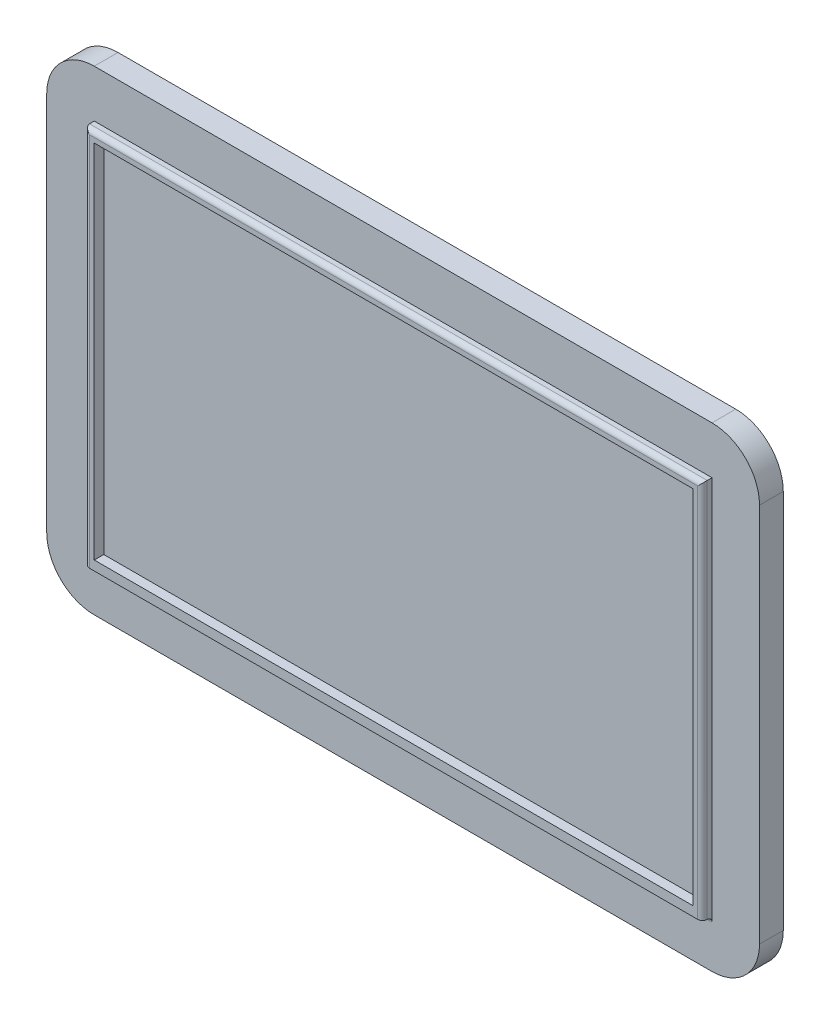
ISO-10303-21;
HEADER;
FILE_DESCRIPTION(('STEP AP214'),'2;1');
FILE_NAME('part.step','',(''),(''),'','','');
FILE_SCHEMA(('AUTOMOTIVE_DESIGN { 1 0 10303 214 1 1 1 1 }'));
ENDSEC;
DATA;
#1=APPLICATION_CONTEXT('core data for automotive mechanical design processes');
#2=APPLICATION_PROTOCOL_DEFINITION('international standard','automotive_design',2000,#1);
#3=PRODUCT_CONTEXT('',#1,'mechanical');
#4=PRODUCT('Part','Part','',(#3));
#5=PRODUCT_RELATED_PRODUCT_CATEGORY('part','',(#4));
#6=PRODUCT_DEFINITION_FORMATION('','',#4);
#7=PRODUCT_DEFINITION_CONTEXT('part definition',#1,'design');
#8=PRODUCT_DEFINITION('design','',#6,#7);
#9=PRODUCT_DEFINITION_SHAPE('','',#8);
#10=(LENGTH_UNIT() NAMED_UNIT(*) SI_UNIT(.MILLI.,.METRE.));
#11=(NAMED_UNIT(*) PLANE_ANGLE_UNIT() SI_UNIT($,.RADIAN.));
#12=(NAMED_UNIT(*) SI_UNIT($,.STERADIAN.) SOLID_ANGLE_UNIT());
#13=UNCERTAINTY_MEASURE_WITH_UNIT(LENGTH_MEASURE(1.E-05),#10,'distance_accuracy_value','');
#14=(GEOMETRIC_REPRESENTATION_CONTEXT(3) GLOBAL_UNCERTAINTY_ASSIGNED_CONTEXT((#13)) GLOBAL_UNIT_ASSIGNED_CONTEXT((#10,
#11,#12)) REPRESENTATION_CONTEXT('',''));
#15=CARTESIAN_POINT('',(0.,0.,0.));
#16=DIRECTION('',(0.,0.,1.));
#17=DIRECTION('',(1.,0.,0.));
#18=AXIS2_PLACEMENT_3D('',#15,#16,#17);
#19=CARTESIAN_POINT('',(65.,40.,0.));
#20=DIRECTION('',(0.,0.,-1.));
#21=DIRECTION('',(-1.,0.,0.));
#22=AXIS2_PLACEMENT_3D('',#19,#20,#21);
#23=PLANE('',#22);
#24=CARTESIAN_POINT('',(65.,40.,0.));
#25=DIRECTION('',(0.,0.,-1.));
#26=DIRECTION('',(-1.,0.,0.));
#27=AXIS2_PLACEMENT_3D('',#24,#25,#26);
#28=CIRCLE('',#27,9.99999999999999);
#29=CARTESIAN_POINT('',(64.9999999999999,50.,0.));
#30=VERTEX_POINT('',#29);
#31=CARTESIAN_POINT('',(75.,39.9999999999999,0.));
#32=VERTEX_POINT('',#31);
#33=EDGE_CURVE('E217',#30,#32,#28,.T.);
#34=ORIENTED_EDGE('',*,*,#33,.F.);
#35=DIRECTION('',(-1.,0.,0.));
#36=VECTOR('',#35,1.);
#37=CARTESIAN_POINT('',(64.9999999999999,50.,0.));
#38=LINE('',#37,#36);
#39=CARTESIAN_POINT('',(-64.9999999999999,50.,0.));
#40=VERTEX_POINT('',#39);
#41=EDGE_CURVE('E222',#30,#40,#38,.T.);
#42=ORIENTED_EDGE('',*,*,#41,.T.);
#43=CARTESIAN_POINT('',(-65.,40.,0.));
#44=DIRECTION('',(0.,0.,1.));
#45=DIRECTION('',(1.,0.,0.));
#46=AXIS2_PLACEMENT_3D('',#43,#44,#45);
#47=CIRCLE('',#46,9.99999999999999);
#48=CARTESIAN_POINT('',(-75.,39.9999999999999,0.));
#49=VERTEX_POINT('',#48);
#50=EDGE_CURVE('E254',#40,#49,#47,.T.);
#51=ORIENTED_EDGE('',*,*,#50,.T.);
#52=DIRECTION('',(0.,-1.,0.));
#53=VECTOR('',#52,1.);
#54=CARTESIAN_POINT('',(-75.,39.9999999999999,0.));
#55=LINE('',#54,#53);
#56=CARTESIAN_POINT('',(-75.,-40.,0.));
#57=VERTEX_POINT('',#56);
#58=EDGE_CURVE('E251',#49,#57,#55,.T.);
#59=ORIENTED_EDGE('',*,*,#58,.T.);
#60=CARTESIAN_POINT('',(-65.,-40.,0.));
#61=DIRECTION('',(0.,0.,-1.));
#62=DIRECTION('',(-1.,0.,0.));
#63=AXIS2_PLACEMENT_3D('',#60,#61,#62);
#64=CIRCLE('',#63,9.99999999999999);
#65=CARTESIAN_POINT('',(-64.9999999999999,-50.,0.));
#66=VERTEX_POINT('',#65);
#67=EDGE_CURVE('E248',#66,#57,#64,.T.);
#68=ORIENTED_EDGE('',*,*,#67,.F.);
#69=DIRECTION('',(-1.,0.,0.));
#70=VECTOR('',#69,1.);
#71=CARTESIAN_POINT('',(64.9999999999999,-50.,0.));
#72=LINE('',#71,#70);
#73=CARTESIAN_POINT('',(64.9999999999999,-50.,0.));
#74=VERTEX_POINT('',#73);
#75=EDGE_CURVE('E246',#74,#66,#72,.T.);
#76=ORIENTED_EDGE('',*,*,#75,.F.);
#77=CARTESIAN_POINT('',(65.,-40.,0.));
#78=DIRECTION('',(0.,0.,-1.));
#79=DIRECTION('',(-1.,0.,0.));
#80=AXIS2_PLACEMENT_3D('',#77,#78,#79);
#81=CIRCLE('',#80,9.99999999999999);
#82=CARTESIAN_POINT('',(75.,-39.9999999999999,0.));
#83=VERTEX_POINT('',#82);
#84=EDGE_CURVE('E244',#83,#74,#81,.T.);
#85=ORIENTED_EDGE('',*,*,#84,.F.);
#86=DIRECTION('',(0.,-1.,0.));
#87=VECTOR('',#86,1.);
#88=CARTESIAN_POINT('',(75.,39.9999999999999,0.));
#89=LINE('',#88,#87);
#90=EDGE_CURVE('E242',#32,#83,#89,.T.);
#91=ORIENTED_EDGE('',*,*,#90,.F.);
#92=EDGE_LOOP('',(#34,#42,#51,#59,#68,#76,#85,#91));
#93=FACE_BOUND('',#92,.T.);
#94=DIRECTION('',(0.,1.,0.));
#95=VECTOR('',#94,1.);
#96=CARTESIAN_POINT('',(65.,-40.,0.));
#97=LINE('',#96,#95);
#98=CARTESIAN_POINT('',(65.,-41.,0.));
#99=VERTEX_POINT('',#98);
#100=CARTESIAN_POINT('',(65.,40.,0.));
#101=VERTEX_POINT('',#100);
#102=EDGE_CURVE('E178',#99,#101,#97,.T.);
#103=ORIENTED_EDGE('',*,*,#102,.F.);
#104=DIRECTION('',(1.,0.,0.));
#105=VECTOR('',#104,1.);
#106=CARTESIAN_POINT('',(-65.,-41.,0.));
#107=LINE('',#106,#105);
#108=CARTESIAN_POINT('',(-65.,-41.,0.));
#109=VERTEX_POINT('',#108);
#110=EDGE_CURVE('E286',#99,#109,#107,.F.);
#111=ORIENTED_EDGE('',*,*,#110,.T.);
#112=DIRECTION('',(0.,-1.,0.));
#113=VECTOR('',#112,1.);
#114=CARTESIAN_POINT('',(-65.,40.,0.));
#115=LINE('',#114,#113);
#116=CARTESIAN_POINT('',(-65.,40.,0.));
#117=VERTEX_POINT('',#116);
#118=EDGE_CURVE('E207',#117,#109,#115,.T.);
#119=ORIENTED_EDGE('',*,*,#118,.F.);
#120=DIRECTION('',(-1.,0.,0.));
#121=VECTOR('',#120,1.);
#122=CARTESIAN_POINT('',(65.,40.,0.));
#123=LINE('',#122,#121);
#124=EDGE_CURVE('E210',#101,#117,#123,.T.);
#125=ORIENTED_EDGE('',*,*,#124,.F.);
#126=EDGE_LOOP('',(#103,#111,#119,#125));
#127=FACE_BOUND('',#126,.T.);
#128=ADVANCED_FACE('F33',(#93,#127),#23,.F.);
#129=CARTESIAN_POINT('',(65.,40.,-5.));
#130=DIRECTION('',(0.,0.,1.));
#131=DIRECTION('',(1.,0.,0.));
#132=AXIS2_PLACEMENT_3D('',#129,#130,#131);
#133=CYLINDRICAL_SURFACE('',#132,9.99999999999999);
#134=ORIENTED_EDGE('',*,*,#33,.T.);
#135=DIRECTION('',(0.,0.,1.));
#136=VECTOR('',#135,1.);
#137=CARTESIAN_POINT('',(75.,39.9999999999999,-5.));
#138=LINE('',#137,#136);
#139=CARTESIAN_POINT('',(75.,39.9999999999999,-5.));
#140=VERTEX_POINT('',#139);
#141=EDGE_CURVE('E275',#140,#32,#138,.T.);
#142=ORIENTED_EDGE('',*,*,#141,.F.);
#143=CARTESIAN_POINT('',(65.,40.,-5.));
#144=DIRECTION('',(0.,0.,-1.));
#145=DIRECTION('',(-1.,0.,0.));
#146=AXIS2_PLACEMENT_3D('',#143,#144,#145);
#147=CIRCLE('',#146,9.99999999999999);
#148=CARTESIAN_POINT('',(64.9999999999999,50.,-5.));
#149=VERTEX_POINT('',#148);
#150=EDGE_CURVE('E218',#149,#140,#147,.T.);
#151=ORIENTED_EDGE('',*,*,#150,.F.);
#152=DIRECTION('',(0.,0.,1.));
#153=VECTOR('',#152,1.);
#154=CARTESIAN_POINT('',(64.9999999999999,50.,-5.));
#155=LINE('',#154,#153);
#156=EDGE_CURVE('E239',#149,#30,#155,.T.);
#157=ORIENTED_EDGE('',*,*,#156,.T.);
#158=EDGE_LOOP('',(#134,#142,#151,#157));
#159=FACE_BOUND('',#158,.T.);
#160=ADVANCED_FACE('F338',(#159),#133,.T.);
#161=CARTESIAN_POINT('',(75.,39.9999999999999,-5.));
#162=DIRECTION('',(-1.,0.,0.));
#163=DIRECTION('',(0.,0.,1.));
#164=AXIS2_PLACEMENT_3D('',#161,#162,#163);
#165=PLANE('',#164);
#166=ORIENTED_EDGE('',*,*,#90,.T.);
#167=DIRECTION('',(0.,0.,1.));
#168=VECTOR('',#167,1.);
#169=CARTESIAN_POINT('',(75.,-39.9999999999999,-5.));
#170=LINE('',#169,#168);
#171=CARTESIAN_POINT('',(75.,-39.9999999999999,-5.));
#172=VERTEX_POINT('',#171);
#173=EDGE_CURVE('E272',#172,#83,#170,.T.);
#174=ORIENTED_EDGE('',*,*,#173,.F.);
#175=DIRECTION('',(0.,-1.,0.));
#176=VECTOR('',#175,1.);
#177=CARTESIAN_POINT('',(75.,39.9999999999999,-5.));
#178=LINE('',#177,#176);
#179=EDGE_CURVE('E221',#140,#172,#178,.T.);
#180=ORIENTED_EDGE('',*,*,#179,.F.);
#181=ORIENTED_EDGE('',*,*,#141,.T.);
#182=EDGE_LOOP('',(#166,#174,#180,#181));
#183=FACE_BOUND('',#182,.T.);
#184=ADVANCED_FACE('F341',(#183),#165,.F.);
#185=CARTESIAN_POINT('',(65.,-40.,-5.));
#186=DIRECTION('',(0.,0.,1.));
#187=DIRECTION('',(1.,0.,0.));
#188=AXIS2_PLACEMENT_3D('',#185,#186,#187);
#189=CYLINDRICAL_SURFACE('',#188,9.99999999999999);
#190=ORIENTED_EDGE('',*,*,#84,.T.);
#191=DIRECTION('',(0.,0.,1.));
#192=VECTOR('',#191,1.);
#193=CARTESIAN_POINT('',(64.9999999999999,-50.,-5.));
#194=LINE('',#193,#192);
#195=CARTESIAN_POINT('',(64.9999999999999,-50.,-5.));
#196=VERTEX_POINT('',#195);
#197=EDGE_CURVE('E269',#196,#74,#194,.T.);
#198=ORIENTED_EDGE('',*,*,#197,.F.);
#199=CARTESIAN_POINT('',(65.,-40.,-5.));
#200=DIRECTION('',(0.,0.,-1.));
#201=DIRECTION('',(-1.,0.,0.));
#202=AXIS2_PLACEMENT_3D('',#199,#200,#201);
#203=CIRCLE('',#202,9.99999999999999);
#204=EDGE_CURVE('E224',#172,#196,#203,.T.);
#205=ORIENTED_EDGE('',*,*,#204,.F.);
#206=ORIENTED_EDGE('',*,*,#173,.T.);
#207=EDGE_LOOP('',(#190,#198,#205,#206));
#208=FACE_BOUND('',#207,.T.);
#209=ADVANCED_FACE('F346',(#208),#189,.T.);
#210=CARTESIAN_POINT('',(64.9999999999999,-50.,-5.));
#211=DIRECTION('',(0.,1.,0.));
#212=DIRECTION('',(0.,0.,1.));
#213=AXIS2_PLACEMENT_3D('',#210,#211,#212);
#214=PLANE('',#213);
#215=ORIENTED_EDGE('',*,*,#75,.T.);
#216=DIRECTION('',(0.,0.,1.));
#217=VECTOR('',#216,1.);
#218=CARTESIAN_POINT('',(-64.9999999999999,-50.,-5.));
#219=LINE('',#218,#217);
#220=CARTESIAN_POINT('',(-64.9999999999999,-50.,-5.));
#221=VERTEX_POINT('',#220);
#222=EDGE_CURVE('E266',#221,#66,#219,.T.);
#223=ORIENTED_EDGE('',*,*,#222,.F.);
#224=DIRECTION('',(-1.,0.,0.));
#225=VECTOR('',#224,1.);
#226=CARTESIAN_POINT('',(64.9999999999999,-50.,-5.));
#227=LINE('',#226,#225);
#228=EDGE_CURVE('E226',#196,#221,#227,.T.);
#229=ORIENTED_EDGE('',*,*,#228,.F.);
#230=ORIENTED_EDGE('',*,*,#197,.T.);
#231=EDGE_LOOP('',(#215,#223,#229,#230));
#232=FACE_BOUND('',#231,.T.);
#233=ADVANCED_FACE('F353',(#232),#214,.F.);
#234=CARTESIAN_POINT('',(-65.,-40.,-5.));
#235=DIRECTION('',(0.,0.,1.));
#236=DIRECTION('',(1.,0.,0.));
#237=AXIS2_PLACEMENT_3D('',#234,#235,#236);
#238=CYLINDRICAL_SURFACE('',#237,9.99999999999999);
#239=ORIENTED_EDGE('',*,*,#67,.T.);
#240=DIRECTION('',(0.,0.,1.));
#241=VECTOR('',#240,1.);
#242=CARTESIAN_POINT('',(-75.,-40.,-5.));
#243=LINE('',#242,#241);
#244=CARTESIAN_POINT('',(-75.,-40.,-5.));
#245=VERTEX_POINT('',#244);
#246=EDGE_CURVE('E264',#245,#57,#243,.T.);
#247=ORIENTED_EDGE('',*,*,#246,.F.);
#248=CARTESIAN_POINT('',(-65.,-40.,-5.));
#249=DIRECTION('',(0.,0.,-1.));
#250=DIRECTION('',(-1.,0.,0.));
#251=AXIS2_PLACEMENT_3D('',#248,#249,#250);
#252=CIRCLE('',#251,9.99999999999999);
#253=EDGE_CURVE('E228',#221,#245,#252,.T.);
#254=ORIENTED_EDGE('',*,*,#253,.F.);
#255=ORIENTED_EDGE('',*,*,#222,.T.);
#256=EDGE_LOOP('',(#239,#247,#254,#255));
#257=FACE_BOUND('',#256,.T.);
#258=ADVANCED_FACE('F357',(#257),#238,.T.);
#259=CARTESIAN_POINT('',(-75.,39.9999999999999,-5.));
#260=DIRECTION('',(-1.,0.,0.));
#261=DIRECTION('',(0.,0.,1.));
#262=AXIS2_PLACEMENT_3D('',#259,#260,#261);
#263=PLANE('',#262);
#264=ORIENTED_EDGE('',*,*,#58,.F.);
#265=DIRECTION('',(0.,0.,1.));
#266=VECTOR('',#265,1.);
#267=CARTESIAN_POINT('',(-75.,39.9999999999999,-5.));
#268=LINE('',#267,#266);
#269=CARTESIAN_POINT('',(-75.,39.9999999999999,-5.));
#270=VERTEX_POINT('',#269);
#271=EDGE_CURVE('E262',#270,#49,#268,.T.);
#272=ORIENTED_EDGE('',*,*,#271,.F.);
#273=DIRECTION('',(0.,-1.,0.));
#274=VECTOR('',#273,1.);
#275=CARTESIAN_POINT('',(-75.,39.9999999999999,-5.));
#276=LINE('',#275,#274);
#277=EDGE_CURVE('E230',#270,#245,#276,.T.);
#278=ORIENTED_EDGE('',*,*,#277,.T.);
#279=ORIENTED_EDGE('',*,*,#246,.T.);
#280=EDGE_LOOP('',(#264,#272,#278,#279));
#281=FACE_BOUND('',#280,.T.);
#282=ADVANCED_FACE('F360',(#281),#263,.T.);
#283=CARTESIAN_POINT('',(-65.,40.,-5.));
#284=DIRECTION('',(0.,0.,1.));
#285=DIRECTION('',(1.,0.,0.));
#286=AXIS2_PLACEMENT_3D('',#283,#284,#285);
#287=CYLINDRICAL_SURFACE('',#286,9.99999999999999);
#288=ORIENTED_EDGE('',*,*,#50,.F.);
#289=DIRECTION('',(0.,0.,1.));
#290=VECTOR('',#289,1.);
#291=CARTESIAN_POINT('',(-64.9999999999999,50.,-5.));
#292=LINE('',#291,#290);
#293=CARTESIAN_POINT('',(-64.9999999999999,50.,-5.));
#294=VERTEX_POINT('',#293);
#295=EDGE_CURVE('E260',#294,#40,#292,.T.);
#296=ORIENTED_EDGE('',*,*,#295,.F.);
#297=CARTESIAN_POINT('',(-65.,40.,-5.));
#298=DIRECTION('',(0.,0.,1.));
#299=DIRECTION('',(1.,0.,0.));
#300=AXIS2_PLACEMENT_3D('',#297,#298,#299);
#301=CIRCLE('',#300,9.99999999999999);
#302=EDGE_CURVE('E233',#294,#270,#301,.T.);
#303=ORIENTED_EDGE('',*,*,#302,.T.);
#304=ORIENTED_EDGE('',*,*,#271,.T.);
#305=EDGE_LOOP('',(#288,#296,#303,#304));
#306=FACE_BOUND('',#305,.T.);
#307=ADVANCED_FACE('F363',(#306),#287,.T.);
#308=CARTESIAN_POINT('',(64.9999999999999,50.,-5.));
#309=DIRECTION('',(0.,1.,0.));
#310=DIRECTION('',(0.,0.,1.));
#311=AXIS2_PLACEMENT_3D('',#308,#309,#310);
#312=PLANE('',#311);
#313=ORIENTED_EDGE('',*,*,#41,.F.);
#314=ORIENTED_EDGE('',*,*,#156,.F.);
#315=DIRECTION('',(-1.,0.,0.));
#316=VECTOR('',#315,1.);
#317=CARTESIAN_POINT('',(64.9999999999999,50.,-5.));
#318=LINE('',#317,#316);
#319=EDGE_CURVE('E236',#149,#294,#318,.T.);
#320=ORIENTED_EDGE('',*,*,#319,.T.);
#321=ORIENTED_EDGE('',*,*,#295,.T.);
#322=EDGE_LOOP('',(#313,#314,#320,#321));
#323=FACE_BOUND('',#322,.T.);
#324=ADVANCED_FACE('F329',(#323),#312,.T.);
#325=CARTESIAN_POINT('',(65.,40.,-5.));
#326=DIRECTION('',(0.,0.,-1.));
#327=DIRECTION('',(-1.,0.,0.));
#328=AXIS2_PLACEMENT_3D('',#325,#326,#327);
#329=PLANE('',#328);
#330=CARTESIAN_POINT('',(30.,0.,-5.));
#331=DIRECTION('',(0.,0.,-1.));
#332=DIRECTION('',(-1.,0.,0.));
#333=AXIS2_PLACEMENT_3D('',#330,#331,#332);
#334=CIRCLE('',#333,2.5);
#335=CARTESIAN_POINT('',(27.5,0.,-5.));
#336=VERTEX_POINT('',#335);
#337=EDGE_CURVE('E311',#336,#336,#334,.T.);
#338=ORIENTED_EDGE('',*,*,#337,.F.);
#339=EDGE_LOOP('',(#338));
#340=FACE_BOUND('',#339,.T.);
#341=CARTESIAN_POINT('',(-30.,0.,-5.));
#342=DIRECTION('',(0.,0.,-1.));
#343=DIRECTION('',(-1.,0.,0.));
#344=AXIS2_PLACEMENT_3D('',#341,#342,#343);
#345=CIRCLE('',#344,2.5);
#346=CARTESIAN_POINT('',(-32.5,0.,-5.));
#347=VERTEX_POINT('',#346);
#348=EDGE_CURVE('E320',#347,#347,#345,.T.);
#349=ORIENTED_EDGE('',*,*,#348,.F.);
#350=EDGE_LOOP('',(#349));
#351=FACE_BOUND('',#350,.T.);
#352=ORIENTED_EDGE('',*,*,#150,.T.);
#353=ORIENTED_EDGE('',*,*,#179,.T.);
#354=ORIENTED_EDGE('',*,*,#204,.T.);
#355=ORIENTED_EDGE('',*,*,#228,.T.);
#356=ORIENTED_EDGE('',*,*,#253,.T.);
#357=ORIENTED_EDGE('',*,*,#277,.F.);
#358=ORIENTED_EDGE('',*,*,#302,.F.);
#359=ORIENTED_EDGE('',*,*,#319,.F.);
#360=EDGE_LOOP('',(#352,#353,#354,#355,#356,#357,#358,#359));
#361=FACE_BOUND('',#360,.T.);
#362=ADVANCED_FACE('F326',(#340,#351,#361),#329,.T.);
#363=CARTESIAN_POINT('',(0.,0.,2.));
#364=DIRECTION('',(0.,0.,1.));
#365=DIRECTION('',(1.,0.,0.));
#366=AXIS2_PLACEMENT_3D('',#363,#364,#365);
#367=PLANE('',#366);
#368=DIRECTION('',(1.,0.,0.));
#369=VECTOR('',#368,1.);
#370=CARTESIAN_POINT('',(-65.,-40.,2.));
#371=LINE('',#370,#369);
#372=CARTESIAN_POINT('',(-64.,-40.,2.));
#373=VERTEX_POINT('',#372);
#374=CARTESIAN_POINT('',(64.,-40.,2.));
#375=VERTEX_POINT('',#374);
#376=EDGE_CURVE('E203',#373,#375,#371,.T.);
#377=ORIENTED_EDGE('',*,*,#376,.T.);
#378=DIRECTION('',(0.,1.,0.));
#379=VECTOR('',#378,1.);
#380=CARTESIAN_POINT('',(64.,40.,2.));
#381=LINE('',#380,#379);
#382=CARTESIAN_POINT('',(64.,39.,2.));
#383=VERTEX_POINT('',#382);
#384=EDGE_CURVE('E293',#375,#383,#381,.T.);
#385=ORIENTED_EDGE('',*,*,#384,.T.);
#386=DIRECTION('',(-1.,0.,0.));
#387=VECTOR('',#386,1.);
#388=CARTESIAN_POINT('',(-65.,39.,2.));
#389=LINE('',#388,#387);
#390=CARTESIAN_POINT('',(-64.,39.,2.));
#391=VERTEX_POINT('',#390);
#392=EDGE_CURVE('E289',#383,#391,#389,.T.);
#393=ORIENTED_EDGE('',*,*,#392,.T.);
#394=DIRECTION('',(0.,-1.,0.));
#395=VECTOR('',#394,1.);
#396=CARTESIAN_POINT('',(-64.,-40.,2.));
#397=LINE('',#396,#395);
#398=EDGE_CURVE('E291',#391,#373,#397,.T.);
#399=ORIENTED_EDGE('',*,*,#398,.T.);
#400=EDGE_LOOP('',(#377,#385,#393,#399));
#401=FACE_BOUND('',#400,.T.);
#402=DIRECTION('',(-1.,0.,0.));
#403=VECTOR('',#402,1.);
#404=CARTESIAN_POINT('',(63.,38.,2.));
#405=LINE('',#404,#403);
#406=CARTESIAN_POINT('',(63.,38.,2.));
#407=VERTEX_POINT('',#406);
#408=CARTESIAN_POINT('',(-63.,38.,2.));
#409=VERTEX_POINT('',#408);
#410=EDGE_CURVE('E170',#407,#409,#405,.T.);
#411=ORIENTED_EDGE('',*,*,#410,.F.);
#412=DIRECTION('',(0.,1.,0.));
#413=VECTOR('',#412,1.);
#414=CARTESIAN_POINT('',(63.,-38.,2.));
#415=LINE('',#414,#413);
#416=CARTESIAN_POINT('',(63.,-38.,2.));
#417=VERTEX_POINT('',#416);
#418=EDGE_CURVE('E160',#417,#407,#415,.T.);
#419=ORIENTED_EDGE('',*,*,#418,.F.);
#420=DIRECTION('',(1.,0.,0.));
#421=VECTOR('',#420,1.);
#422=CARTESIAN_POINT('',(-63.,-38.,2.));
#423=LINE('',#422,#421);
#424=CARTESIAN_POINT('',(-63.,-38.,2.));
#425=VERTEX_POINT('',#424);
#426=EDGE_CURVE('E186',#425,#417,#423,.T.);
#427=ORIENTED_EDGE('',*,*,#426,.F.);
#428=DIRECTION('',(0.,-1.,0.));
#429=VECTOR('',#428,1.);
#430=CARTESIAN_POINT('',(-63.,38.,2.));
#431=LINE('',#430,#429);
#432=EDGE_CURVE('E184',#409,#425,#431,.T.);
#433=ORIENTED_EDGE('',*,*,#432,.F.);
#434=EDGE_LOOP('',(#411,#419,#427,#433));
#435=FACE_BOUND('',#434,.T.);
#436=ADVANCED_FACE('F182',(#401,#435),#367,.T.);
#437=CARTESIAN_POINT('',(65.,-40.,2.));
#438=DIRECTION('',(-1.,0.,0.));
#439=DIRECTION('',(0.,0.,1.));
#440=AXIS2_PLACEMENT_3D('',#437,#438,#439);
#441=PLANE('',#440);
#442=DIRECTION('',(0.,0.,-1.));
#443=VECTOR('',#442,1.);
#444=CARTESIAN_POINT('',(65.,40.,2.));
#445=LINE('',#444,#443);
#446=CARTESIAN_POINT('',(65.,40.,1.));
#447=VERTEX_POINT('',#446);
#448=EDGE_CURVE('E215',#447,#101,#445,.T.);
#449=ORIENTED_EDGE('',*,*,#448,.F.);
#450=DIRECTION('',(0.,1.,0.));
#451=VECTOR('',#450,1.);
#452=CARTESIAN_POINT('',(65.,-40.,1.));
#453=LINE('',#452,#451);
#454=CARTESIAN_POINT('',(65.,-40.,1.));
#455=VERTEX_POINT('',#454);
#456=EDGE_CURVE('E296',#447,#455,#453,.F.);
#457=ORIENTED_EDGE('',*,*,#456,.T.);
#458=CARTESIAN_POINT('',(65.,-41.,1.));
#459=DIRECTION('',(-1.,0.,0.));
#460=DIRECTION('',(0.,0.,1.));
#461=AXIS2_PLACEMENT_3D('',#458,#459,#460);
#462=CIRCLE('',#461,1.);
#463=EDGE_CURVE('E42',#455,#99,#462,.T.);
#464=ORIENTED_EDGE('',*,*,#463,.T.);
#465=ORIENTED_EDGE('',*,*,#102,.T.);
#466=EDGE_LOOP('',(#449,#457,#464,#465));
#467=FACE_BOUND('',#466,.T.);
#468=ADVANCED_FACE('F376',(#467),#441,.F.);
#469=CARTESIAN_POINT('',(65.,40.,2.));
#470=DIRECTION('',(0.,-1.,0.));
#471=DIRECTION('',(0.,0.,-1.));
#472=AXIS2_PLACEMENT_3D('',#469,#470,#471);
#473=PLANE('',#472);
#474=DIRECTION('',(0.,0.,-1.));
#475=VECTOR('',#474,1.);
#476=CARTESIAN_POINT('',(-65.,40.,2.));
#477=LINE('',#476,#475);
#478=CARTESIAN_POINT('',(-65.,40.,1.));
#479=VERTEX_POINT('',#478);
#480=EDGE_CURVE('E206',#479,#117,#477,.T.);
#481=ORIENTED_EDGE('',*,*,#480,.F.);
#482=DIRECTION('',(-1.,0.,0.));
#483=VECTOR('',#482,1.);
#484=CARTESIAN_POINT('',(65.,40.,1.));
#485=LINE('',#484,#483);
#486=EDGE_CURVE('E56',#479,#447,#485,.F.);
#487=ORIENTED_EDGE('',*,*,#486,.T.);
#488=ORIENTED_EDGE('',*,*,#448,.T.);
#489=ORIENTED_EDGE('',*,*,#124,.T.);
#490=EDGE_LOOP('',(#481,#487,#488,#489));
#491=FACE_BOUND('',#490,.T.);
#492=ADVANCED_FACE('F426',(#491),#473,.F.);
#493=CARTESIAN_POINT('',(-65.,40.,2.));
#494=DIRECTION('',(1.,0.,0.));
#495=DIRECTION('',(0.,0.,-1.));
#496=AXIS2_PLACEMENT_3D('',#493,#494,#495);
#497=PLANE('',#496);
#498=ORIENTED_EDGE('',*,*,#118,.T.);
#499=CARTESIAN_POINT('',(-65.,-41.,1.));
#500=DIRECTION('',(1.,0.,0.));
#501=DIRECTION('',(0.,0.,-1.));
#502=AXIS2_PLACEMENT_3D('',#499,#500,#501);
#503=CIRCLE('',#502,1.);
#504=CARTESIAN_POINT('',(-65.,-40.,1.));
#505=VERTEX_POINT('',#504);
#506=EDGE_CURVE('E11',#109,#505,#503,.T.);
#507=ORIENTED_EDGE('',*,*,#506,.T.);
#508=DIRECTION('',(0.,-1.,0.));
#509=VECTOR('',#508,1.);
#510=CARTESIAN_POINT('',(-65.,40.,1.));
#511=LINE('',#510,#509);
#512=EDGE_CURVE('E49',#505,#479,#511,.F.);
#513=ORIENTED_EDGE('',*,*,#512,.T.);
#514=ORIENTED_EDGE('',*,*,#480,.T.);
#515=EDGE_LOOP('',(#498,#507,#513,#514));
#516=FACE_BOUND('',#515,.T.);
#517=ADVANCED_FACE('F380',(#516),#497,.F.);
#518=CARTESIAN_POINT('',(-65.,-40.,2.));
#519=DIRECTION('',(0.,1.,0.));
#520=DIRECTION('',(0.,0.,1.));
#521=AXIS2_PLACEMENT_3D('',#518,#519,#520);
#522=PLANE('',#521);
#523=DIRECTION('',(1.,0.,0.));
#524=VECTOR('',#523,1.);
#525=CARTESIAN_POINT('',(65.,-40.,1.));
#526=LINE('',#525,#524);
#527=EDGE_CURVE('E281',#505,#455,#526,.T.);
#528=ORIENTED_EDGE('',*,*,#527,.T.);
#529=CARTESIAN_POINT('',(64.,-40.,1.));
#530=DIRECTION('',(0.,1.,0.));
#531=DIRECTION('',(0.,0.,1.));
#532=AXIS2_PLACEMENT_3D('',#529,#530,#531);
#533=CIRCLE('',#532,1.);
#534=EDGE_CURVE('E284',#455,#375,#533,.F.);
#535=ORIENTED_EDGE('',*,*,#534,.T.);
#536=ORIENTED_EDGE('',*,*,#376,.F.);
#537=CARTESIAN_POINT('',(-64.,-40.,1.));
#538=DIRECTION('',(0.,1.,0.));
#539=DIRECTION('',(0.,0.,1.));
#540=AXIS2_PLACEMENT_3D('',#537,#538,#539);
#541=CIRCLE('',#540,1.);
#542=EDGE_CURVE('E278',#373,#505,#541,.F.);
#543=ORIENTED_EDGE('',*,*,#542,.T.);
#544=EDGE_LOOP('',(#528,#535,#536,#543));
#545=FACE_BOUND('',#544,.T.);
#546=ADVANCED_FACE('F384',(#545),#522,.F.);
#547=CARTESIAN_POINT('',(63.,-38.,2.));
#548=DIRECTION('',(-1.,0.,0.));
#549=DIRECTION('',(0.,0.,1.));
#550=AXIS2_PLACEMENT_3D('',#547,#548,#549);
#551=PLANE('',#550);
#552=DIRECTION('',(0.,1.,0.));
#553=VECTOR('',#552,1.);
#554=CARTESIAN_POINT('',(63.,-38.,0.));
#555=LINE('',#554,#553);
#556=CARTESIAN_POINT('',(63.,-38.,0.));
#557=VERTEX_POINT('',#556);
#558=CARTESIAN_POINT('',(63.,38.,0.));
#559=VERTEX_POINT('',#558);
#560=EDGE_CURVE('E191',#557,#559,#555,.T.);
#561=ORIENTED_EDGE('',*,*,#560,.F.);
#562=DIRECTION('',(0.,0.,-1.));
#563=VECTOR('',#562,1.);
#564=CARTESIAN_POINT('',(63.,-38.,2.));
#565=LINE('',#564,#563);
#566=EDGE_CURVE('E166',#417,#557,#565,.T.);
#567=ORIENTED_EDGE('',*,*,#566,.F.);
#568=ORIENTED_EDGE('',*,*,#418,.T.);
#569=DIRECTION('',(0.,0.,-1.));
#570=VECTOR('',#569,1.);
#571=CARTESIAN_POINT('',(63.,38.,2.));
#572=LINE('',#571,#570);
#573=EDGE_CURVE('E164',#407,#559,#572,.T.);
#574=ORIENTED_EDGE('',*,*,#573,.T.);
#575=EDGE_LOOP('',(#561,#567,#568,#574));
#576=FACE_BOUND('',#575,.T.);
#577=ADVANCED_FACE('F163',(#576),#551,.T.);
#578=CARTESIAN_POINT('',(63.,38.,2.));
#579=DIRECTION('',(0.,-1.,0.));
#580=DIRECTION('',(0.,0.,-1.));
#581=AXIS2_PLACEMENT_3D('',#578,#579,#580);
#582=PLANE('',#581);
#583=DIRECTION('',(-1.,0.,0.));
#584=VECTOR('',#583,1.);
#585=CARTESIAN_POINT('',(63.,38.,0.));
#586=LINE('',#585,#584);
#587=CARTESIAN_POINT('',(-63.,38.,0.));
#588=VERTEX_POINT('',#587);
#589=EDGE_CURVE('E177',#559,#588,#586,.T.);
#590=ORIENTED_EDGE('',*,*,#589,.F.);
#591=ORIENTED_EDGE('',*,*,#573,.F.);
#592=ORIENTED_EDGE('',*,*,#410,.T.);
#593=DIRECTION('',(0.,0.,-1.));
#594=VECTOR('',#593,1.);
#595=CARTESIAN_POINT('',(-63.,38.,2.));
#596=LINE('',#595,#594);
#597=EDGE_CURVE('E179',#409,#588,#596,.T.);
#598=ORIENTED_EDGE('',*,*,#597,.T.);
#599=EDGE_LOOP('',(#590,#591,#592,#598));
#600=FACE_BOUND('',#599,.T.);
#601=ADVANCED_FACE('F174',(#600),#582,.T.);
#602=CARTESIAN_POINT('',(-63.,38.,2.));
#603=DIRECTION('',(1.,0.,0.));
#604=DIRECTION('',(0.,0.,-1.));
#605=AXIS2_PLACEMENT_3D('',#602,#603,#604);
#606=PLANE('',#605);
#607=DIRECTION('',(0.,-1.,0.));
#608=VECTOR('',#607,1.);
#609=CARTESIAN_POINT('',(-63.,38.,0.));
#610=LINE('',#609,#608);
#611=CARTESIAN_POINT('',(-63.,-38.,0.));
#612=VERTEX_POINT('',#611);
#613=EDGE_CURVE('E194',#588,#612,#610,.T.);
#614=ORIENTED_EDGE('',*,*,#613,.F.);
#615=ORIENTED_EDGE('',*,*,#597,.F.);
#616=ORIENTED_EDGE('',*,*,#432,.T.);
#617=DIRECTION('',(0.,0.,-1.));
#618=VECTOR('',#617,1.);
#619=CARTESIAN_POINT('',(-63.,-38.,2.));
#620=LINE('',#619,#618);
#621=EDGE_CURVE('E200',#425,#612,#620,.T.);
#622=ORIENTED_EDGE('',*,*,#621,.T.);
#623=EDGE_LOOP('',(#614,#615,#616,#622));
#624=FACE_BOUND('',#623,.T.);
#625=ADVANCED_FACE('F439',(#624),#606,.T.);
#626=CARTESIAN_POINT('',(-63.,-38.,2.));
#627=DIRECTION('',(0.,1.,0.));
#628=DIRECTION('',(0.,0.,1.));
#629=AXIS2_PLACEMENT_3D('',#626,#627,#628);
#630=PLANE('',#629);
#631=DIRECTION('',(1.,0.,0.));
#632=VECTOR('',#631,1.);
#633=CARTESIAN_POINT('',(-63.,-38.,0.));
#634=LINE('',#633,#632);
#635=EDGE_CURVE('E171',#612,#557,#634,.T.);
#636=ORIENTED_EDGE('',*,*,#635,.F.);
#637=ORIENTED_EDGE('',*,*,#621,.F.);
#638=ORIENTED_EDGE('',*,*,#426,.T.);
#639=ORIENTED_EDGE('',*,*,#566,.T.);
#640=EDGE_LOOP('',(#636,#637,#638,#639));
#641=FACE_BOUND('',#640,.T.);
#642=ADVANCED_FACE('F421',(#641),#630,.T.);
#643=ORIENTED_EDGE('',*,*,#635,.T.);
#644=ORIENTED_EDGE('',*,*,#560,.T.);
#645=ORIENTED_EDGE('',*,*,#589,.T.);
#646=ORIENTED_EDGE('',*,*,#613,.T.);
#647=EDGE_LOOP('',(#643,#644,#645,#646));
#648=FACE_BOUND('',#647,.T.);
#649=ADVANCED_FACE('F370',(#648),#23,.F.);
#650=CARTESIAN_POINT('',(-65.,-41.,1.));
#651=DIRECTION('',(-1.,0.,0.));
#652=DIRECTION('',(0.,0.,1.));
#653=AXIS2_PLACEMENT_3D('',#650,#651,#652);
#654=CYLINDRICAL_SURFACE('',#653,1.);
#655=ORIENTED_EDGE('',*,*,#506,.F.);
#656=ORIENTED_EDGE('',*,*,#110,.F.);
#657=ORIENTED_EDGE('',*,*,#463,.F.);
#658=ORIENTED_EDGE('',*,*,#527,.F.);
#659=EDGE_LOOP('',(#655,#656,#657,#658));
#660=FACE_BOUND('',#659,.T.);
#661=ADVANCED_FACE('F379',(#660),#654,.F.);
#662=CARTESIAN_POINT('',(-64.,0.,1.));
#663=DIRECTION('',(0.,1.,0.));
#664=DIRECTION('',(0.,0.,1.));
#665=AXIS2_PLACEMENT_3D('',#662,#663,#664);
#666=CYLINDRICAL_SURFACE('',#665,1.);
#667=ORIENTED_EDGE('',*,*,#542,.F.);
#668=ORIENTED_EDGE('',*,*,#398,.F.);
#669=CARTESIAN_POINT('',(-64.,39.,1.));
#670=DIRECTION('',(0.707106781186547,0.707106781186547,0.));
#671=DIRECTION('',(0.707106781186547,-0.707106781186547,0.));
#672=AXIS2_PLACEMENT_3D('',#669,#670,#671);
#673=ELLIPSE('',#672,1.41421356237309,1.);
#674=EDGE_CURVE('E37',#479,#391,#673,.T.);
#675=ORIENTED_EDGE('',*,*,#674,.F.);
#676=ORIENTED_EDGE('',*,*,#512,.F.);
#677=EDGE_LOOP('',(#667,#668,#675,#676));
#678=FACE_BOUND('',#677,.T.);
#679=ADVANCED_FACE('F35',(#678),#666,.T.);
#680=CARTESIAN_POINT('',(0.,39.,1.));
#681=DIRECTION('',(1.,0.,0.));
#682=DIRECTION('',(0.,0.,-1.));
#683=AXIS2_PLACEMENT_3D('',#680,#681,#682);
#684=CYLINDRICAL_SURFACE('',#683,1.);
#685=ORIENTED_EDGE('',*,*,#674,.T.);
#686=ORIENTED_EDGE('',*,*,#392,.F.);
#687=CARTESIAN_POINT('',(64.,39.,1.));
#688=DIRECTION('',(0.707106781186547,-0.707106781186547,0.));
#689=DIRECTION('',(0.707106781186547,0.707106781186547,0.));
#690=AXIS2_PLACEMENT_3D('',#687,#688,#689);
#691=ELLIPSE('',#690,1.41421356237309,1.);
#692=EDGE_CURVE('E302',#447,#383,#691,.T.);
#693=ORIENTED_EDGE('',*,*,#692,.F.);
#694=ORIENTED_EDGE('',*,*,#486,.F.);
#695=EDGE_LOOP('',(#685,#686,#693,#694));
#696=FACE_BOUND('',#695,.T.);
#697=ADVANCED_FACE('F390',(#696),#684,.T.);
#698=CARTESIAN_POINT('',(64.,0.,1.));
#699=DIRECTION('',(0.,-1.,0.));
#700=DIRECTION('',(0.,0.,-1.));
#701=AXIS2_PLACEMENT_3D('',#698,#699,#700);
#702=CYLINDRICAL_SURFACE('',#701,1.);
#703=ORIENTED_EDGE('',*,*,#534,.F.);
#704=ORIENTED_EDGE('',*,*,#456,.F.);
#705=ORIENTED_EDGE('',*,*,#692,.T.);
#706=ORIENTED_EDGE('',*,*,#384,.F.);
#707=EDGE_LOOP('',(#703,#704,#705,#706));
#708=FACE_BOUND('',#707,.T.);
#709=ADVANCED_FACE('F392',(#708),#702,.T.);
#710=CARTESIAN_POINT('',(-30.,0.,-2.));
#711=DIRECTION('',(0.,0.,-1.));
#712=DIRECTION('',(-1.,0.,0.));
#713=AXIS2_PLACEMENT_3D('',#710,#711,#712);
#714=CYLINDRICAL_SURFACE('',#713,2.5);
#715=CARTESIAN_POINT('',(-30.,0.,-2.));
#716=DIRECTION('',(0.,0.,-1.));
#717=DIRECTION('',(-1.,0.,0.));
#718=AXIS2_PLACEMENT_3D('',#715,#716,#717);
#719=CIRCLE('',#718,2.5);
#720=CARTESIAN_POINT('',(-32.5,0.,-2.));
#721=VERTEX_POINT('',#720);
#722=EDGE_CURVE('E316',#721,#721,#719,.T.);
#723=ORIENTED_EDGE('',*,*,#722,.F.);
#724=EDGE_LOOP('',(#723));
#725=FACE_BOUND('',#724,.T.);
#726=ORIENTED_EDGE('',*,*,#348,.T.);
#727=EDGE_LOOP('',(#726));
#728=FACE_BOUND('',#727,.T.);
#729=ADVANCED_FACE('F324',(#725,#728),#714,.F.);
#730=CARTESIAN_POINT('',(-30.,0.,-2.));
#731=DIRECTION('',(0.,0.,-1.));
#732=DIRECTION('',(-1.,0.,0.));
#733=AXIS2_PLACEMENT_3D('',#730,#731,#732);
#734=PLANE('',#733);
#735=ORIENTED_EDGE('',*,*,#722,.T.);
#736=EDGE_LOOP('',(#735));
#737=FACE_BOUND('',#736,.T.);
#738=ADVANCED_FACE('F399',(#737),#734,.T.);
#739=CARTESIAN_POINT('',(30.,0.,-2.));
#740=DIRECTION('',(0.,0.,-1.));
#741=DIRECTION('',(-1.,0.,0.));
#742=AXIS2_PLACEMENT_3D('',#739,#740,#741);
#743=CYLINDRICAL_SURFACE('',#742,2.5);
#744=CARTESIAN_POINT('',(30.,0.,-2.));
#745=DIRECTION('',(0.,0.,-1.));
#746=DIRECTION('',(-1.,0.,0.));
#747=AXIS2_PLACEMENT_3D('',#744,#745,#746);
#748=CIRCLE('',#747,2.5);
#749=CARTESIAN_POINT('',(27.5,0.,-2.));
#750=VERTEX_POINT('',#749);
#751=EDGE_CURVE('E303',#750,#750,#748,.T.);
#752=ORIENTED_EDGE('',*,*,#751,.F.);
#753=EDGE_LOOP('',(#752));
#754=FACE_BOUND('',#753,.T.);
#755=ORIENTED_EDGE('',*,*,#337,.T.);
#756=EDGE_LOOP('',(#755));
#757=FACE_BOUND('',#756,.T.);
#758=ADVANCED_FACE('F448',(#754,#757),#743,.F.);
#759=CARTESIAN_POINT('',(30.,0.,-2.));
#760=DIRECTION('',(0.,0.,-1.));
#761=DIRECTION('',(-1.,0.,0.));
#762=AXIS2_PLACEMENT_3D('',#759,#760,#761);
#763=PLANE('',#762);
#764=ORIENTED_EDGE('',*,*,#751,.T.);
#765=EDGE_LOOP('',(#764));
#766=FACE_BOUND('',#765,.T.);
#767=ADVANCED_FACE('F452',(#766),#763,.T.);
#768=CLOSED_SHELL('',(#128,#160,#184,#209,#233,#258,#282,#307,#324,#362,#436,#468,#492,#517,
#546,#577,#601,#625,#642,#649,#661,#679,#697,#709,#729,#738,#758,#767));
#769=MANIFOLD_SOLID_BREP('B2',#768);
#770=ADVANCED_BREP_SHAPE_REPRESENTATION('',(#18,#769),#14);
#771=SHAPE_DEFINITION_REPRESENTATION(#9,#770);
ENDSEC;
END-ISO-10303-21;
